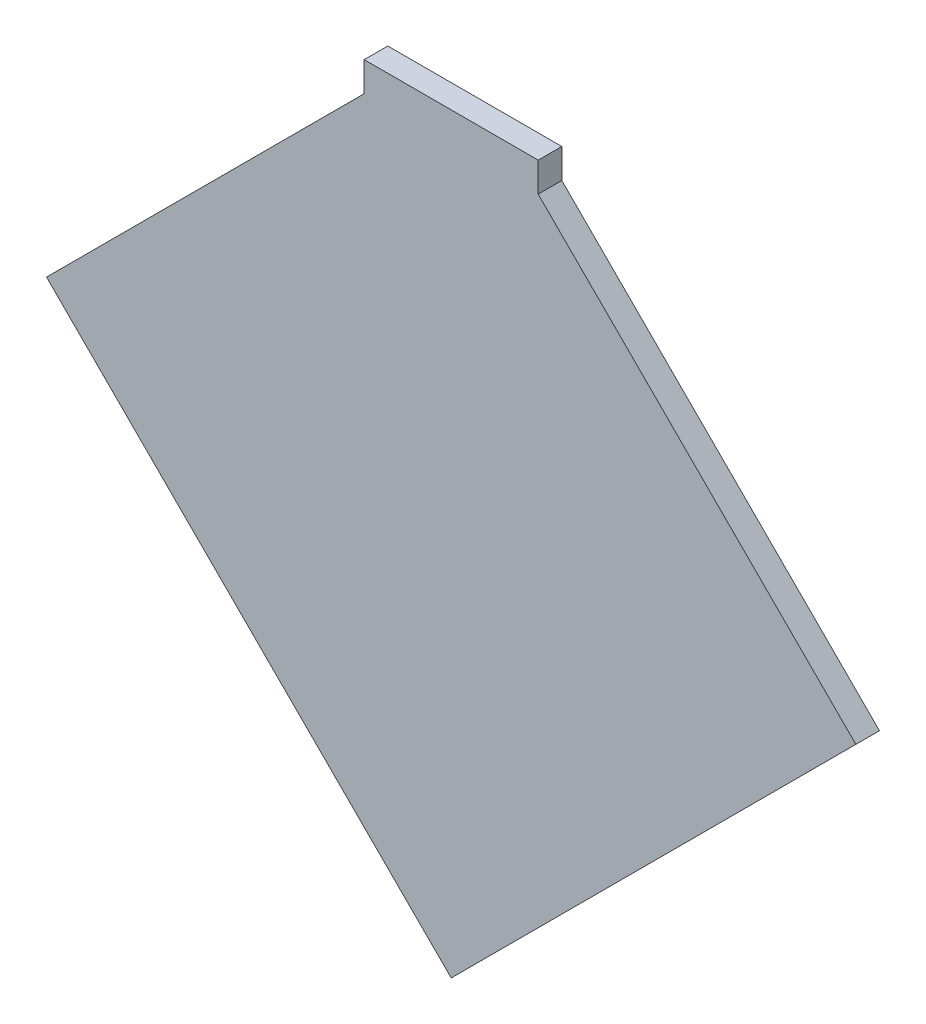
ISO-10303-21;
HEADER;
FILE_DESCRIPTION(('STEP AP214'),'2;1');
FILE_NAME('part.step','',(''),(''),'','','');
FILE_SCHEMA(('AUTOMOTIVE_DESIGN { 1 0 10303 214 1 1 1 1 }'));
ENDSEC;
DATA;
#1=APPLICATION_CONTEXT('core data for automotive mechanical design processes');
#2=APPLICATION_PROTOCOL_DEFINITION('international standard','automotive_design',2000,#1);
#3=PRODUCT_CONTEXT('',#1,'mechanical');
#4=PRODUCT('Part','Part','',(#3));
#5=PRODUCT_RELATED_PRODUCT_CATEGORY('part','',(#4));
#6=PRODUCT_DEFINITION_FORMATION('','',#4);
#7=PRODUCT_DEFINITION_CONTEXT('part definition',#1,'design');
#8=PRODUCT_DEFINITION('design','',#6,#7);
#9=PRODUCT_DEFINITION_SHAPE('','',#8);
#10=(LENGTH_UNIT() NAMED_UNIT(*) SI_UNIT(.MILLI.,.METRE.));
#11=(NAMED_UNIT(*) PLANE_ANGLE_UNIT() SI_UNIT($,.RADIAN.));
#12=(NAMED_UNIT(*) SI_UNIT($,.STERADIAN.) SOLID_ANGLE_UNIT());
#13=UNCERTAINTY_MEASURE_WITH_UNIT(LENGTH_MEASURE(1.E-05),#10,'distance_accuracy_value','');
#14=(GEOMETRIC_REPRESENTATION_CONTEXT(3) GLOBAL_UNCERTAINTY_ASSIGNED_CONTEXT((#13)) GLOBAL_UNIT_ASSIGNED_CONTEXT((#10,
#11,#12)) REPRESENTATION_CONTEXT('',''));
#15=CARTESIAN_POINT('',(0.,0.,0.));
#16=DIRECTION('',(0.,0.,1.));
#17=DIRECTION('',(1.,0.,0.));
#18=AXIS2_PLACEMENT_3D('',#15,#16,#17);
#19=CARTESIAN_POINT('',(-10.2884036662643,10.2884036662643,1.2));
#20=DIRECTION('',(-0.707106781186548,0.707106781186548,0.));
#21=DIRECTION('',(-0.707106781186548,-0.707106781186548,0.));
#22=AXIS2_PLACEMENT_3D('',#19,#20,#21);
#23=PLANE('',#22);
#24=DIRECTION('',(0.707106781186548,0.707106781186548,0.));
#25=VECTOR('',#24,1.);
#26=CARTESIAN_POINT('',(-10.2884036662643,10.2884036662643,0.));
#27=LINE('',#26,#25);
#28=CARTESIAN_POINT('',(-20.5768073325285,0.,0.));
#29=VERTEX_POINT('',#28);
#30=CARTESIAN_POINT('',(-4.4242640687119,16.1525432638166,0.));
#31=VERTEX_POINT('',#30);
#32=EDGE_CURVE('E108',#29,#31,#27,.T.);
#33=ORIENTED_EDGE('',*,*,#32,.F.);
#34=DIRECTION('',(0.,0.,-1.));
#35=VECTOR('',#34,1.);
#36=CARTESIAN_POINT('',(-20.5768073325285,0.,1.2));
#37=LINE('',#36,#35);
#38=CARTESIAN_POINT('',(-20.5768073325285,0.,1.2));
#39=VERTEX_POINT('',#38);
#40=EDGE_CURVE('E11',#39,#29,#37,.T.);
#41=ORIENTED_EDGE('',*,*,#40,.F.);
#42=DIRECTION('',(0.707106781186548,0.707106781186548,0.));
#43=VECTOR('',#42,1.);
#44=CARTESIAN_POINT('',(-10.2884036662643,10.2884036662643,1.2));
#45=LINE('',#44,#43);
#46=CARTESIAN_POINT('',(-4.4242640687119,16.1525432638166,1.2));
#47=VERTEX_POINT('',#46);
#48=EDGE_CURVE('E51',#39,#47,#45,.T.);
#49=ORIENTED_EDGE('',*,*,#48,.T.);
#50=DIRECTION('',(0.,0.,-1.));
#51=VECTOR('',#50,1.);
#52=CARTESIAN_POINT('',(-4.4242640687119,16.1525432638166,1.2));
#53=LINE('',#52,#51);
#54=EDGE_CURVE('E73',#47,#31,#53,.T.);
#55=ORIENTED_EDGE('',*,*,#54,.T.);
#56=EDGE_LOOP('',(#33,#41,#49,#55));
#57=FACE_BOUND('',#56,.T.);
#58=ADVANCED_FACE('F35',(#57),#23,.T.);
#59=CARTESIAN_POINT('',(-10.2884036662643,-10.2884036662643,1.2));
#60=DIRECTION('',(0.707106781186548,0.707106781186548,0.));
#61=DIRECTION('',(-0.707106781186548,0.707106781186548,0.));
#62=AXIS2_PLACEMENT_3D('',#59,#60,#61);
#63=PLANE('',#62);
#64=DIRECTION('',(0.707106781186548,-0.707106781186548,0.));
#65=VECTOR('',#64,1.);
#66=CARTESIAN_POINT('',(-10.2884036662643,-10.2884036662643,0.));
#67=LINE('',#66,#65);
#68=CARTESIAN_POINT('',(0.,-20.5768073325285,0.));
#69=VERTEX_POINT('',#68);
#70=EDGE_CURVE('E110',#29,#69,#67,.T.);
#71=ORIENTED_EDGE('',*,*,#70,.T.);
#72=DIRECTION('',(0.,0.,-1.));
#73=VECTOR('',#72,1.);
#74=CARTESIAN_POINT('',(0.,-20.5768073325285,1.2));
#75=LINE('',#74,#73);
#76=CARTESIAN_POINT('',(0.,-20.5768073325285,1.2));
#77=VERTEX_POINT('',#76);
#78=EDGE_CURVE('E43',#77,#69,#75,.T.);
#79=ORIENTED_EDGE('',*,*,#78,.F.);
#80=DIRECTION('',(0.707106781186548,-0.707106781186548,0.));
#81=VECTOR('',#80,1.);
#82=CARTESIAN_POINT('',(-10.2884036662643,-10.2884036662643,1.2));
#83=LINE('',#82,#81);
#84=EDGE_CURVE('E91',#39,#77,#83,.T.);
#85=ORIENTED_EDGE('',*,*,#84,.F.);
#86=ORIENTED_EDGE('',*,*,#40,.T.);
#87=EDGE_LOOP('',(#71,#79,#85,#86));
#88=FACE_BOUND('',#87,.T.);
#89=ADVANCED_FACE('F161',(#88),#63,.F.);
#90=CARTESIAN_POINT('',(10.2884036662643,-10.2884036662643,1.2));
#91=DIRECTION('',(-0.707106781186548,0.707106781186548,0.));
#92=DIRECTION('',(-0.707106781186548,-0.707106781186548,0.));
#93=AXIS2_PLACEMENT_3D('',#90,#91,#92);
#94=PLANE('',#93);
#95=DIRECTION('',(0.707106781186548,0.707106781186548,0.));
#96=VECTOR('',#95,1.);
#97=CARTESIAN_POINT('',(10.2884036662643,-10.2884036662643,0.));
#98=LINE('',#97,#96);
#99=CARTESIAN_POINT('',(20.5768073325295,9.74914593498966E-13,0.));
#100=VERTEX_POINT('',#99);
#101=EDGE_CURVE('E69',#69,#100,#98,.T.);
#102=ORIENTED_EDGE('',*,*,#101,.T.);
#103=DIRECTION('',(0.,0.,-1.));
#104=VECTOR('',#103,1.);
#105=CARTESIAN_POINT('',(20.5768073325295,9.74914593498966E-13,1.2));
#106=LINE('',#105,#104);
#107=CARTESIAN_POINT('',(20.5768073325295,9.74914593498966E-13,1.2));
#108=VERTEX_POINT('',#107);
#109=EDGE_CURVE('E94',#108,#100,#106,.T.);
#110=ORIENTED_EDGE('',*,*,#109,.F.);
#111=DIRECTION('',(0.707106781186548,0.707106781186548,0.));
#112=VECTOR('',#111,1.);
#113=CARTESIAN_POINT('',(10.2884036662643,-10.2884036662643,1.2));
#114=LINE('',#113,#112);
#115=EDGE_CURVE('E85',#77,#108,#114,.T.);
#116=ORIENTED_EDGE('',*,*,#115,.F.);
#117=ORIENTED_EDGE('',*,*,#78,.T.);
#118=EDGE_LOOP('',(#102,#110,#116,#117));
#119=FACE_BOUND('',#118,.T.);
#120=ADVANCED_FACE('F95',(#119),#94,.F.);
#121=CARTESIAN_POINT('',(10.288403666264,10.2884036662652,1.2));
#122=DIRECTION('',(-0.707106781186504,-0.70710678118659,0.));
#123=DIRECTION('',(0.707106781186591,-0.707106781186505,0.));
#124=AXIS2_PLACEMENT_3D('',#121,#122,#123);
#125=PLANE('',#124);
#126=DIRECTION('',(-0.707106781186591,0.707106781186505,0.));
#127=VECTOR('',#126,1.);
#128=CARTESIAN_POINT('',(10.288403666264,10.2884036662652,0.));
#129=LINE('',#128,#127);
#130=CARTESIAN_POINT('',(4.42426406871193,16.1525432638166,0.));
#131=VERTEX_POINT('',#130);
#132=EDGE_CURVE('E114',#100,#131,#129,.T.);
#133=ORIENTED_EDGE('',*,*,#132,.T.);
#134=DIRECTION('',(0.,0.,-1.));
#135=VECTOR('',#134,1.);
#136=CARTESIAN_POINT('',(4.42426406871193,16.1525432638166,1.2));
#137=LINE('',#136,#135);
#138=CARTESIAN_POINT('',(4.42426406871193,16.1525432638166,1.2));
#139=VERTEX_POINT('',#138);
#140=EDGE_CURVE('E99',#139,#131,#137,.T.);
#141=ORIENTED_EDGE('',*,*,#140,.F.);
#142=DIRECTION('',(-0.707106781186591,0.707106781186505,0.));
#143=VECTOR('',#142,1.);
#144=CARTESIAN_POINT('',(10.288403666264,10.2884036662652,1.2));
#145=LINE('',#144,#143);
#146=EDGE_CURVE('E89',#108,#139,#145,.T.);
#147=ORIENTED_EDGE('',*,*,#146,.F.);
#148=ORIENTED_EDGE('',*,*,#109,.T.);
#149=EDGE_LOOP('',(#133,#141,#147,#148));
#150=FACE_BOUND('',#149,.T.);
#151=ADVANCED_FACE('F101',(#150),#125,.F.);
#152=CARTESIAN_POINT('',(0.,0.,1.2));
#153=DIRECTION('',(0.,0.,1.));
#154=DIRECTION('',(1.,0.,0.));
#155=AXIS2_PLACEMENT_3D('',#152,#153,#154);
#156=PLANE('',#155);
#157=ORIENTED_EDGE('',*,*,#48,.F.);
#158=ORIENTED_EDGE('',*,*,#84,.T.);
#159=ORIENTED_EDGE('',*,*,#115,.T.);
#160=ORIENTED_EDGE('',*,*,#146,.T.);
#161=DIRECTION('',(0.,1.,0.));
#162=VECTOR('',#161,1.);
#163=CARTESIAN_POINT('',(4.42426406871193,16.1525432638166,1.2));
#164=LINE('',#163,#162);
#165=CARTESIAN_POINT('',(4.42426406871193,17.6525432638166,1.2));
#166=VERTEX_POINT('',#165);
#167=EDGE_CURVE('E111',#139,#166,#164,.T.);
#168=ORIENTED_EDGE('',*,*,#167,.T.);
#169=DIRECTION('',(-1.,0.,0.));
#170=VECTOR('',#169,1.);
#171=CARTESIAN_POINT('',(-4.4242640687119,17.6525432638166,1.2));
#172=LINE('',#171,#170);
#173=CARTESIAN_POINT('',(-4.4242640687119,17.6525432638166,1.2));
#174=VERTEX_POINT('',#173);
#175=EDGE_CURVE('E138',#166,#174,#172,.T.);
#176=ORIENTED_EDGE('',*,*,#175,.T.);
#177=DIRECTION('',(0.,-1.,0.));
#178=VECTOR('',#177,1.);
#179=CARTESIAN_POINT('',(-4.4242640687119,16.1525432638166,1.2));
#180=LINE('',#179,#178);
#181=EDGE_CURVE('E135',#174,#47,#180,.T.);
#182=ORIENTED_EDGE('',*,*,#181,.T.);
#183=EDGE_LOOP('',(#157,#158,#159,#160,#168,#176,#182));
#184=FACE_BOUND('',#183,.T.);
#185=ADVANCED_FACE('F86',(#184),#156,.T.);
#186=CARTESIAN_POINT('',(0.,0.,0.));
#187=DIRECTION('',(0.,0.,1.));
#188=DIRECTION('',(1.,0.,0.));
#189=AXIS2_PLACEMENT_3D('',#186,#187,#188);
#190=PLANE('',#189);
#191=ORIENTED_EDGE('',*,*,#32,.T.);
#192=DIRECTION('',(0.,-1.,0.));
#193=VECTOR('',#192,1.);
#194=CARTESIAN_POINT('',(-4.4242640687119,16.1525432638166,0.));
#195=LINE('',#194,#193);
#196=CARTESIAN_POINT('',(-4.4242640687119,17.6525432638166,0.));
#197=VERTEX_POINT('',#196);
#198=EDGE_CURVE('E141',#197,#31,#195,.T.);
#199=ORIENTED_EDGE('',*,*,#198,.F.);
#200=DIRECTION('',(-1.,0.,0.));
#201=VECTOR('',#200,1.);
#202=CARTESIAN_POINT('',(-4.4242640687119,17.6525432638166,0.));
#203=LINE('',#202,#201);
#204=CARTESIAN_POINT('',(4.42426406871193,17.6525432638166,0.));
#205=VERTEX_POINT('',#204);
#206=EDGE_CURVE('E145',#205,#197,#203,.T.);
#207=ORIENTED_EDGE('',*,*,#206,.F.);
#208=DIRECTION('',(0.,1.,0.));
#209=VECTOR('',#208,1.);
#210=CARTESIAN_POINT('',(4.42426406871193,16.1525432638166,0.));
#211=LINE('',#210,#209);
#212=EDGE_CURVE('E124',#131,#205,#211,.T.);
#213=ORIENTED_EDGE('',*,*,#212,.F.);
#214=ORIENTED_EDGE('',*,*,#132,.F.);
#215=ORIENTED_EDGE('',*,*,#101,.F.);
#216=ORIENTED_EDGE('',*,*,#70,.F.);
#217=EDGE_LOOP('',(#191,#199,#207,#213,#214,#215,#216));
#218=FACE_BOUND('',#217,.T.);
#219=ADVANCED_FACE('F119',(#218),#190,.F.);
#220=CARTESIAN_POINT('',(-4.4242640687119,16.1525432638166,10.1747674175313));
#221=DIRECTION('',(1.,0.,0.));
#222=DIRECTION('',(0.,0.,-1.));
#223=AXIS2_PLACEMENT_3D('',#220,#221,#222);
#224=PLANE('',#223);
#225=ORIENTED_EDGE('',*,*,#181,.F.);
#226=DIRECTION('',(0.,0.,-1.));
#227=VECTOR('',#226,1.);
#228=CARTESIAN_POINT('',(-4.4242640687119,17.6525432638166,10.1747674175313));
#229=LINE('',#228,#227);
#230=EDGE_CURVE('E147',#174,#197,#229,.T.);
#231=ORIENTED_EDGE('',*,*,#230,.T.);
#232=ORIENTED_EDGE('',*,*,#198,.T.);
#233=ORIENTED_EDGE('',*,*,#54,.F.);
#234=EDGE_LOOP('',(#225,#231,#232,#233));
#235=FACE_BOUND('',#234,.T.);
#236=ADVANCED_FACE('F175',(#235),#224,.F.);
#237=CARTESIAN_POINT('',(4.42426406871193,16.1525432638166,10.1747674175313));
#238=DIRECTION('',(-1.,0.,0.));
#239=DIRECTION('',(0.,0.,1.));
#240=AXIS2_PLACEMENT_3D('',#237,#238,#239);
#241=PLANE('',#240);
#242=ORIENTED_EDGE('',*,*,#167,.F.);
#243=ORIENTED_EDGE('',*,*,#140,.T.);
#244=ORIENTED_EDGE('',*,*,#212,.T.);
#245=DIRECTION('',(0.,0.,-1.));
#246=VECTOR('',#245,1.);
#247=CARTESIAN_POINT('',(4.42426406871193,17.6525432638166,10.1747674175313));
#248=LINE('',#247,#246);
#249=EDGE_CURVE('E132',#166,#205,#248,.T.);
#250=ORIENTED_EDGE('',*,*,#249,.F.);
#251=EDGE_LOOP('',(#242,#243,#244,#250));
#252=FACE_BOUND('',#251,.T.);
#253=ADVANCED_FACE('F128',(#252),#241,.F.);
#254=CARTESIAN_POINT('',(-4.4242640687119,17.6525432638166,10.1747674175313));
#255=DIRECTION('',(0.,-1.,0.));
#256=DIRECTION('',(0.,0.,-1.));
#257=AXIS2_PLACEMENT_3D('',#254,#255,#256);
#258=PLANE('',#257);
#259=ORIENTED_EDGE('',*,*,#175,.F.);
#260=ORIENTED_EDGE('',*,*,#249,.T.);
#261=ORIENTED_EDGE('',*,*,#206,.T.);
#262=ORIENTED_EDGE('',*,*,#230,.F.);
#263=EDGE_LOOP('',(#259,#260,#261,#262));
#264=FACE_BOUND('',#263,.T.);
#265=ADVANCED_FACE('F158',(#264),#258,.F.);
#266=CLOSED_SHELL('',(#58,#89,#120,#151,#185,#219,#236,#253,#265));
#267=MANIFOLD_SOLID_BREP('B2',#266);
#268=ADVANCED_BREP_SHAPE_REPRESENTATION('',(#18,#267),#14);
#269=SHAPE_DEFINITION_REPRESENTATION(#9,#268);
ENDSEC;
END-ISO-10303-21;
